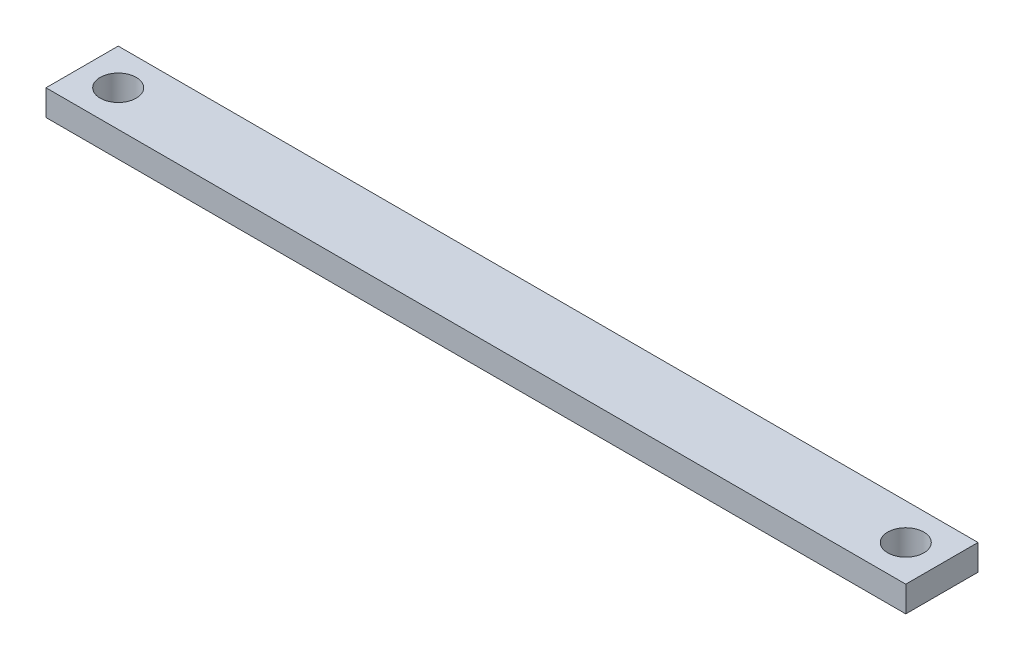
ISO-10303-21;
HEADER;
FILE_DESCRIPTION(('STEP AP214'),'2;1');
FILE_NAME('part.step','',(''),(''),'','','');
FILE_SCHEMA(('AUTOMOTIVE_DESIGN { 1 0 10303 214 1 1 1 1 }'));
ENDSEC;
DATA;
#1=APPLICATION_CONTEXT('core data for automotive mechanical design processes');
#2=APPLICATION_PROTOCOL_DEFINITION('international standard','automotive_design',2000,#1);
#3=PRODUCT_CONTEXT('',#1,'mechanical');
#4=PRODUCT('Part','Part','',(#3));
#5=PRODUCT_RELATED_PRODUCT_CATEGORY('part','',(#4));
#6=PRODUCT_DEFINITION_FORMATION('','',#4);
#7=PRODUCT_DEFINITION_CONTEXT('part definition',#1,'design');
#8=PRODUCT_DEFINITION('design','',#6,#7);
#9=PRODUCT_DEFINITION_SHAPE('','',#8);
#10=(LENGTH_UNIT() NAMED_UNIT(*) SI_UNIT(.MILLI.,.METRE.));
#11=(NAMED_UNIT(*) PLANE_ANGLE_UNIT() SI_UNIT($,.RADIAN.));
#12=(NAMED_UNIT(*) SI_UNIT($,.STERADIAN.) SOLID_ANGLE_UNIT());
#13=UNCERTAINTY_MEASURE_WITH_UNIT(LENGTH_MEASURE(1.E-05),#10,'distance_accuracy_value','');
#14=(GEOMETRIC_REPRESENTATION_CONTEXT(3) GLOBAL_UNCERTAINTY_ASSIGNED_CONTEXT((#13)) GLOBAL_UNIT_ASSIGNED_CONTEXT((#10,
#11,#12)) REPRESENTATION_CONTEXT('',''));
#15=CARTESIAN_POINT('',(0.,0.,0.));
#16=DIRECTION('',(0.,0.,1.));
#17=DIRECTION('',(1.,0.,0.));
#18=AXIS2_PLACEMENT_3D('',#15,#16,#17);
#19=CARTESIAN_POINT('',(-260.,15.,-21.));
#20=DIRECTION('',(0.,0.,1.));
#21=DIRECTION('',(1.,0.,0.));
#22=AXIS2_PLACEMENT_3D('',#19,#20,#21);
#23=PLANE('',#22);
#24=DIRECTION('',(-1.,0.,0.));
#25=VECTOR('',#24,1.);
#26=CARTESIAN_POINT('',(-260.,0.,-21.));
#27=LINE('',#26,#25);
#28=CARTESIAN_POINT('',(250.,0.,-21.));
#29=VERTEX_POINT('',#28);
#30=CARTESIAN_POINT('',(-250.,0.,-21.));
#31=VERTEX_POINT('',#30);
#32=EDGE_CURVE('E105',#29,#31,#27,.T.);
#33=ORIENTED_EDGE('',*,*,#32,.T.);
#34=DIRECTION('',(0.,1.,0.));
#35=VECTOR('',#34,1.);
#36=CARTESIAN_POINT('',(-250.,0.,-21.));
#37=LINE('',#36,#35);
#38=CARTESIAN_POINT('',(-250.,15.,-21.));
#39=VERTEX_POINT('',#38);
#40=EDGE_CURVE('E53',#31,#39,#37,.T.);
#41=ORIENTED_EDGE('',*,*,#40,.T.);
#42=DIRECTION('',(-1.,0.,0.));
#43=VECTOR('',#42,1.);
#44=CARTESIAN_POINT('',(-260.,15.,-21.));
#45=LINE('',#44,#43);
#46=CARTESIAN_POINT('',(250.,15.,-21.));
#47=VERTEX_POINT('',#46);
#48=EDGE_CURVE('E45',#47,#39,#45,.T.);
#49=ORIENTED_EDGE('',*,*,#48,.F.);
#50=DIRECTION('',(0.,1.,0.));
#51=VECTOR('',#50,1.);
#52=CARTESIAN_POINT('',(250.,0.,-21.));
#53=LINE('',#52,#51);
#54=EDGE_CURVE('E95',#29,#47,#53,.T.);
#55=ORIENTED_EDGE('',*,*,#54,.F.);
#56=EDGE_LOOP('',(#33,#41,#49,#55));
#57=FACE_BOUND('',#56,.T.);
#58=ADVANCED_FACE('F37',(#57),#23,.F.);
#59=CARTESIAN_POINT('',(-260.,15.,21.));
#60=DIRECTION('',(0.,0.,-1.));
#61=DIRECTION('',(-1.,0.,0.));
#62=AXIS2_PLACEMENT_3D('',#59,#60,#61);
#63=PLANE('',#62);
#64=DIRECTION('',(1.,0.,0.));
#65=VECTOR('',#64,1.);
#66=CARTESIAN_POINT('',(-260.,15.,21.));
#67=LINE('',#66,#65);
#68=CARTESIAN_POINT('',(-250.,15.,21.));
#69=VERTEX_POINT('',#68);
#70=CARTESIAN_POINT('',(250.,15.,21.));
#71=VERTEX_POINT('',#70);
#72=EDGE_CURVE('E11',#69,#71,#67,.T.);
#73=ORIENTED_EDGE('',*,*,#72,.F.);
#74=DIRECTION('',(0.,1.,0.));
#75=VECTOR('',#74,1.);
#76=CARTESIAN_POINT('',(-250.,0.,21.));
#77=LINE('',#76,#75);
#78=CARTESIAN_POINT('',(-250.,0.,21.));
#79=VERTEX_POINT('',#78);
#80=EDGE_CURVE('E77',#79,#69,#77,.T.);
#81=ORIENTED_EDGE('',*,*,#80,.F.);
#82=DIRECTION('',(1.,0.,0.));
#83=VECTOR('',#82,1.);
#84=CARTESIAN_POINT('',(-260.,0.,21.));
#85=LINE('',#84,#83);
#86=CARTESIAN_POINT('',(250.,0.,21.));
#87=VERTEX_POINT('',#86);
#88=EDGE_CURVE('E40',#79,#87,#85,.T.);
#89=ORIENTED_EDGE('',*,*,#88,.T.);
#90=DIRECTION('',(0.,1.,0.));
#91=VECTOR('',#90,1.);
#92=CARTESIAN_POINT('',(250.,0.,21.));
#93=LINE('',#92,#91);
#94=EDGE_CURVE('E61',#87,#71,#93,.T.);
#95=ORIENTED_EDGE('',*,*,#94,.T.);
#96=EDGE_LOOP('',(#73,#81,#89,#95));
#97=FACE_BOUND('',#96,.T.);
#98=ADVANCED_FACE('F94',(#97),#63,.F.);
#99=CARTESIAN_POINT('',(0.,15.,0.));
#100=DIRECTION('',(0.,-1.,0.));
#101=DIRECTION('',(0.,0.,-1.));
#102=AXIS2_PLACEMENT_3D('',#99,#100,#101);
#103=PLANE('',#102);
#104=CARTESIAN_POINT('',(-228.999999999999,15.,0.));
#105=DIRECTION('',(0.,1.,0.));
#106=DIRECTION('',(0.,0.,1.));
#107=AXIS2_PLACEMENT_3D('',#104,#105,#106);
#108=CIRCLE('',#107,10.5);
#109=CARTESIAN_POINT('',(-228.999999999999,15.,10.5));
#110=VERTEX_POINT('',#109);
#111=EDGE_CURVE('E106',#110,#110,#108,.T.);
#112=ORIENTED_EDGE('',*,*,#111,.F.);
#113=EDGE_LOOP('',(#112));
#114=FACE_BOUND('',#113,.T.);
#115=CARTESIAN_POINT('',(229.,15.,0.));
#116=DIRECTION('',(0.,1.,0.));
#117=DIRECTION('',(0.,0.,1.));
#118=AXIS2_PLACEMENT_3D('',#115,#116,#117);
#119=CIRCLE('',#118,10.5);
#120=CARTESIAN_POINT('',(229.,15.,10.5));
#121=VERTEX_POINT('',#120);
#122=EDGE_CURVE('E109',#121,#121,#119,.T.);
#123=ORIENTED_EDGE('',*,*,#122,.F.);
#124=EDGE_LOOP('',(#123));
#125=FACE_BOUND('',#124,.T.);
#126=ORIENTED_EDGE('',*,*,#48,.T.);
#127=DIRECTION('',(0.,0.,-1.));
#128=VECTOR('',#127,1.);
#129=CARTESIAN_POINT('',(-250.,15.,21.));
#130=LINE('',#129,#128);
#131=EDGE_CURVE('E80',#69,#39,#130,.T.);
#132=ORIENTED_EDGE('',*,*,#131,.F.);
#133=ORIENTED_EDGE('',*,*,#72,.T.);
#134=DIRECTION('',(0.,0.,1.));
#135=VECTOR('',#134,1.);
#136=CARTESIAN_POINT('',(250.,15.,21.));
#137=LINE('',#136,#135);
#138=EDGE_CURVE('E92',#47,#71,#137,.T.);
#139=ORIENTED_EDGE('',*,*,#138,.F.);
#140=EDGE_LOOP('',(#126,#132,#133,#139));
#141=FACE_BOUND('',#140,.T.);
#142=ADVANCED_FACE('F89',(#114,#125,#141),#103,.F.);
#143=CARTESIAN_POINT('',(0.,0.,0.));
#144=DIRECTION('',(0.,-1.,0.));
#145=DIRECTION('',(0.,0.,-1.));
#146=AXIS2_PLACEMENT_3D('',#143,#144,#145);
#147=PLANE('',#146);
#148=DIRECTION('',(0.,0.,-1.));
#149=VECTOR('',#148,1.);
#150=CARTESIAN_POINT('',(-250.,0.,21.));
#151=LINE('',#150,#149);
#152=EDGE_CURVE('E81',#79,#31,#151,.T.);
#153=ORIENTED_EDGE('',*,*,#152,.T.);
#154=ORIENTED_EDGE('',*,*,#32,.F.);
#155=DIRECTION('',(0.,0.,1.));
#156=VECTOR('',#155,1.);
#157=CARTESIAN_POINT('',(250.,0.,21.));
#158=LINE('',#157,#156);
#159=EDGE_CURVE('E97',#29,#87,#158,.T.);
#160=ORIENTED_EDGE('',*,*,#159,.T.);
#161=ORIENTED_EDGE('',*,*,#88,.F.);
#162=EDGE_LOOP('',(#153,#154,#160,#161));
#163=FACE_BOUND('',#162,.T.);
#164=CARTESIAN_POINT('',(-228.999999999999,0.,0.));
#165=DIRECTION('',(0.,1.,0.));
#166=DIRECTION('',(0.,0.,1.));
#167=AXIS2_PLACEMENT_3D('',#164,#165,#166);
#168=CIRCLE('',#167,10.5);
#169=CARTESIAN_POINT('',(-228.999999999999,0.,10.5));
#170=VERTEX_POINT('',#169);
#171=EDGE_CURVE('E102',#170,#170,#168,.T.);
#172=ORIENTED_EDGE('',*,*,#171,.T.);
#173=EDGE_LOOP('',(#172));
#174=FACE_BOUND('',#173,.T.);
#175=CARTESIAN_POINT('',(229.,0.,0.));
#176=DIRECTION('',(0.,1.,0.));
#177=DIRECTION('',(0.,0.,1.));
#178=AXIS2_PLACEMENT_3D('',#175,#176,#177);
#179=CIRCLE('',#178,10.5);
#180=CARTESIAN_POINT('',(229.,0.,10.5));
#181=VERTEX_POINT('',#180);
#182=EDGE_CURVE('E112',#181,#181,#179,.T.);
#183=ORIENTED_EDGE('',*,*,#182,.T.);
#184=EDGE_LOOP('',(#183));
#185=FACE_BOUND('',#184,.T.);
#186=ADVANCED_FACE('F120',(#163,#174,#185),#147,.T.);
#187=CARTESIAN_POINT('',(229.,0.,0.));
#188=DIRECTION('',(0.,1.,0.));
#189=DIRECTION('',(0.,0.,1.));
#190=AXIS2_PLACEMENT_3D('',#187,#188,#189);
#191=CYLINDRICAL_SURFACE('',#190,10.5);
#192=ORIENTED_EDGE('',*,*,#182,.F.);
#193=EDGE_LOOP('',(#192));
#194=FACE_BOUND('',#193,.T.);
#195=ORIENTED_EDGE('',*,*,#122,.T.);
#196=EDGE_LOOP('',(#195));
#197=FACE_BOUND('',#196,.T.);
#198=ADVANCED_FACE('F133',(#194,#197),#191,.F.);
#199=CARTESIAN_POINT('',(-228.999999999999,0.,0.));
#200=DIRECTION('',(0.,1.,0.));
#201=DIRECTION('',(0.,0.,1.));
#202=AXIS2_PLACEMENT_3D('',#199,#200,#201);
#203=CYLINDRICAL_SURFACE('',#202,10.5);
#204=ORIENTED_EDGE('',*,*,#171,.F.);
#205=EDGE_LOOP('',(#204));
#206=FACE_BOUND('',#205,.T.);
#207=ORIENTED_EDGE('',*,*,#111,.T.);
#208=EDGE_LOOP('',(#207));
#209=FACE_BOUND('',#208,.T.);
#210=ADVANCED_FACE('F126',(#206,#209),#203,.F.);
#211=CARTESIAN_POINT('',(250.,0.,21.));
#212=DIRECTION('',(-1.,0.,0.));
#213=DIRECTION('',(0.,0.,1.));
#214=AXIS2_PLACEMENT_3D('',#211,#212,#213);
#215=PLANE('',#214);
#216=ORIENTED_EDGE('',*,*,#138,.T.);
#217=ORIENTED_EDGE('',*,*,#94,.F.);
#218=ORIENTED_EDGE('',*,*,#159,.F.);
#219=ORIENTED_EDGE('',*,*,#54,.T.);
#220=EDGE_LOOP('',(#216,#217,#218,#219));
#221=FACE_BOUND('',#220,.T.);
#222=ADVANCED_FACE('F124',(#221),#215,.F.);
#223=CARTESIAN_POINT('',(-250.,0.,21.));
#224=DIRECTION('',(1.,0.,0.));
#225=DIRECTION('',(0.,0.,-1.));
#226=AXIS2_PLACEMENT_3D('',#223,#224,#225);
#227=PLANE('',#226);
#228=ORIENTED_EDGE('',*,*,#131,.T.);
#229=ORIENTED_EDGE('',*,*,#40,.F.);
#230=ORIENTED_EDGE('',*,*,#152,.F.);
#231=ORIENTED_EDGE('',*,*,#80,.T.);
#232=EDGE_LOOP('',(#228,#229,#230,#231));
#233=FACE_BOUND('',#232,.T.);
#234=ADVANCED_FACE('F79',(#233),#227,.F.);
#235=CLOSED_SHELL('',(#58,#98,#142,#186,#198,#210,#222,#234));
#236=MANIFOLD_SOLID_BREP('B2',#235);
#237=ADVANCED_BREP_SHAPE_REPRESENTATION('',(#18,#236),#14);
#238=SHAPE_DEFINITION_REPRESENTATION(#9,#237);
ENDSEC;
END-ISO-10303-21;
